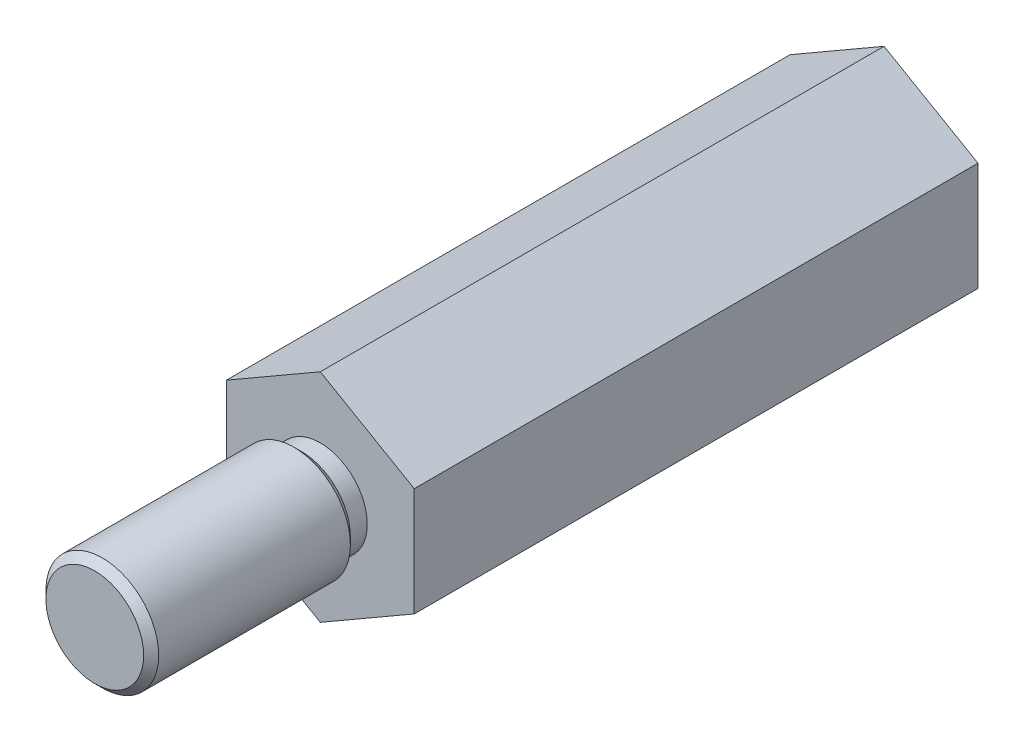
ISO-10303-21;
HEADER;
FILE_DESCRIPTION(('STEP AP214'),'2;1');
FILE_NAME('part.step','',(''),(''),'','','');
FILE_SCHEMA(('AUTOMOTIVE_DESIGN { 1 0 10303 214 1 1 1 1 }'));
ENDSEC;
DATA;
#1=APPLICATION_CONTEXT('core data for automotive mechanical design processes');
#2=APPLICATION_PROTOCOL_DEFINITION('international standard','automotive_design',2000,#1);
#3=PRODUCT_CONTEXT('',#1,'mechanical');
#4=PRODUCT('Part','Part','',(#3));
#5=PRODUCT_RELATED_PRODUCT_CATEGORY('part','',(#4));
#6=PRODUCT_DEFINITION_FORMATION('','',#4);
#7=PRODUCT_DEFINITION_CONTEXT('part definition',#1,'design');
#8=PRODUCT_DEFINITION('design','',#6,#7);
#9=PRODUCT_DEFINITION_SHAPE('','',#8);
#10=(LENGTH_UNIT() NAMED_UNIT(*) SI_UNIT(.MILLI.,.METRE.));
#11=(NAMED_UNIT(*) PLANE_ANGLE_UNIT() SI_UNIT($,.RADIAN.));
#12=(NAMED_UNIT(*) SI_UNIT($,.STERADIAN.) SOLID_ANGLE_UNIT());
#13=UNCERTAINTY_MEASURE_WITH_UNIT(LENGTH_MEASURE(1.E-05),#10,'distance_accuracy_value','');
#14=(GEOMETRIC_REPRESENTATION_CONTEXT(3) GLOBAL_UNCERTAINTY_ASSIGNED_CONTEXT((#13)) GLOBAL_UNIT_ASSIGNED_CONTEXT((#10,
#11,#12)) REPRESENTATION_CONTEXT('',''));
#15=CARTESIAN_POINT('',(0.,0.,0.));
#16=DIRECTION('',(0.,0.,1.));
#17=DIRECTION('',(1.,0.,0.));
#18=AXIS2_PLACEMENT_3D('',#15,#16,#17);
#19=CARTESIAN_POINT('',(0.,2.88675134594813,15.));
#20=DIRECTION('',(0.,0.,1.));
#21=DIRECTION('',(1.,0.,0.));
#22=AXIS2_PLACEMENT_3D('',#19,#20,#21);
#23=PLANE('',#22);
#24=DIRECTION('',(-0.866025403784439,0.5,0.));
#25=VECTOR('',#24,1.);
#26=CARTESIAN_POINT('',(2.5,1.44337567297407,15.));
#27=LINE('',#26,#25);
#28=CARTESIAN_POINT('',(2.5,1.44337567297407,15.));
#29=VERTEX_POINT('',#28);
#30=CARTESIAN_POINT('',(0.,2.88675134594813,15.));
#31=VERTEX_POINT('',#30);
#32=EDGE_CURVE('E130',#29,#31,#27,.T.);
#33=ORIENTED_EDGE('',*,*,#32,.T.);
#34=DIRECTION('',(-0.866025403784438,-0.5,0.));
#35=VECTOR('',#34,1.);
#36=CARTESIAN_POINT('',(0.,2.88675134594813,15.));
#37=LINE('',#36,#35);
#38=CARTESIAN_POINT('',(-2.5,1.44337567297407,15.));
#39=VERTEX_POINT('',#38);
#40=EDGE_CURVE('E87',#31,#39,#37,.T.);
#41=ORIENTED_EDGE('',*,*,#40,.T.);
#42=DIRECTION('',(0.,-1.,0.));
#43=VECTOR('',#42,1.);
#44=CARTESIAN_POINT('',(-2.5,1.44337567297407,15.));
#45=LINE('',#44,#43);
#46=CARTESIAN_POINT('',(-2.5,-1.44337567297406,15.));
#47=VERTEX_POINT('',#46);
#48=EDGE_CURVE('E101',#39,#47,#45,.T.);
#49=ORIENTED_EDGE('',*,*,#48,.T.);
#50=DIRECTION('',(0.866025403784439,-0.5,0.));
#51=VECTOR('',#50,1.);
#52=CARTESIAN_POINT('',(-2.5,-1.44337567297406,15.));
#53=LINE('',#52,#51);
#54=CARTESIAN_POINT('',(0.,-2.88675134594813,15.));
#55=VERTEX_POINT('',#54);
#56=EDGE_CURVE('E95',#47,#55,#53,.T.);
#57=ORIENTED_EDGE('',*,*,#56,.T.);
#58=DIRECTION('',(0.866025403784439,0.5,0.));
#59=VECTOR('',#58,1.);
#60=CARTESIAN_POINT('',(0.,-2.88675134594813,15.));
#61=LINE('',#60,#59);
#62=CARTESIAN_POINT('',(2.5,-1.44337567297407,15.));
#63=VERTEX_POINT('',#62);
#64=EDGE_CURVE('E99',#55,#63,#61,.T.);
#65=ORIENTED_EDGE('',*,*,#64,.T.);
#66=DIRECTION('',(0.,1.,0.));
#67=VECTOR('',#66,1.);
#68=CARTESIAN_POINT('',(2.5,-1.44337567297407,15.));
#69=LINE('',#68,#67);
#70=EDGE_CURVE('E48',#63,#29,#69,.T.);
#71=ORIENTED_EDGE('',*,*,#70,.T.);
#72=EDGE_LOOP('',(#33,#41,#49,#57,#65,#71));
#73=FACE_BOUND('',#72,.T.);
#74=CARTESIAN_POINT('',(0.,0.,15.));
#75=DIRECTION('',(0.,0.,1.));
#76=DIRECTION('',(1.,0.,0.));
#77=AXIS2_PLACEMENT_3D('',#74,#75,#76);
#78=CIRCLE('',#77,1.25);
#79=CARTESIAN_POINT('',(1.25,0.,15.));
#80=VERTEX_POINT('',#79);
#81=EDGE_CURVE('E212',#80,#80,#78,.T.);
#82=ORIENTED_EDGE('',*,*,#81,.F.);
#83=EDGE_LOOP('',(#82));
#84=FACE_BOUND('',#83,.T.);
#85=ADVANCED_FACE('F31',(#73,#84),#23,.T.);
#86=CARTESIAN_POINT('',(2.5,1.44337567297407,15.));
#87=DIRECTION('',(-0.5,-0.866025403784439,0.));
#88=DIRECTION('',(0.866025403784439,-0.5,0.));
#89=AXIS2_PLACEMENT_3D('',#86,#87,#88);
#90=PLANE('',#89);
#91=DIRECTION('',(-0.866025403784439,0.5,0.));
#92=VECTOR('',#91,1.);
#93=CARTESIAN_POINT('',(2.5,1.44337567297407,0.));
#94=LINE('',#93,#92);
#95=CARTESIAN_POINT('',(2.5,1.44337567297407,0.));
#96=VERTEX_POINT('',#95);
#97=CARTESIAN_POINT('',(0.,2.88675134594813,0.));
#98=VERTEX_POINT('',#97);
#99=EDGE_CURVE('E119',#96,#98,#94,.T.);
#100=ORIENTED_EDGE('',*,*,#99,.T.);
#101=DIRECTION('',(0.,0.,-1.));
#102=VECTOR('',#101,1.);
#103=CARTESIAN_POINT('',(0.,2.88675134594813,15.));
#104=LINE('',#103,#102);
#105=EDGE_CURVE('E137',#31,#98,#104,.T.);
#106=ORIENTED_EDGE('',*,*,#105,.F.);
#107=ORIENTED_EDGE('',*,*,#32,.F.);
#108=DIRECTION('',(0.,0.,-1.));
#109=VECTOR('',#108,1.);
#110=CARTESIAN_POINT('',(2.5,1.44337567297407,15.));
#111=LINE('',#110,#109);
#112=EDGE_CURVE('E115',#29,#96,#111,.T.);
#113=ORIENTED_EDGE('',*,*,#112,.T.);
#114=EDGE_LOOP('',(#100,#106,#107,#113));
#115=FACE_BOUND('',#114,.T.);
#116=ADVANCED_FACE('F177',(#115),#90,.F.);
#117=CARTESIAN_POINT('',(0.,2.88675134594813,15.));
#118=DIRECTION('',(0.5,-0.866025403784438,0.));
#119=DIRECTION('',(0.866025403784439,0.5,0.));
#120=AXIS2_PLACEMENT_3D('',#117,#118,#119);
#121=PLANE('',#120);
#122=DIRECTION('',(-0.866025403784438,-0.5,0.));
#123=VECTOR('',#122,1.);
#124=CARTESIAN_POINT('',(0.,2.88675134594813,0.));
#125=LINE('',#124,#123);
#126=CARTESIAN_POINT('',(-2.5,1.44337567297407,0.));
#127=VERTEX_POINT('',#126);
#128=EDGE_CURVE('E122',#98,#127,#125,.T.);
#129=ORIENTED_EDGE('',*,*,#128,.T.);
#130=DIRECTION('',(0.,0.,-1.));
#131=VECTOR('',#130,1.);
#132=CARTESIAN_POINT('',(-2.5,1.44337567297407,15.));
#133=LINE('',#132,#131);
#134=EDGE_CURVE('E134',#39,#127,#133,.T.);
#135=ORIENTED_EDGE('',*,*,#134,.F.);
#136=ORIENTED_EDGE('',*,*,#40,.F.);
#137=ORIENTED_EDGE('',*,*,#105,.T.);
#138=EDGE_LOOP('',(#129,#135,#136,#137));
#139=FACE_BOUND('',#138,.T.);
#140=ADVANCED_FACE('F182',(#139),#121,.F.);
#141=CARTESIAN_POINT('',(-2.5,1.44337567297407,15.));
#142=DIRECTION('',(1.,0.,0.));
#143=DIRECTION('',(0.,0.,-1.));
#144=AXIS2_PLACEMENT_3D('',#141,#142,#143);
#145=PLANE('',#144);
#146=DIRECTION('',(0.,-1.,0.));
#147=VECTOR('',#146,1.);
#148=CARTESIAN_POINT('',(-2.5,1.44337567297407,0.));
#149=LINE('',#148,#147);
#150=CARTESIAN_POINT('',(-2.5,-1.44337567297406,0.));
#151=VERTEX_POINT('',#150);
#152=EDGE_CURVE('E125',#127,#151,#149,.T.);
#153=ORIENTED_EDGE('',*,*,#152,.T.);
#154=DIRECTION('',(0.,0.,-1.));
#155=VECTOR('',#154,1.);
#156=CARTESIAN_POINT('',(-2.5,-1.44337567297406,15.));
#157=LINE('',#156,#155);
#158=EDGE_CURVE('E110',#47,#151,#157,.T.);
#159=ORIENTED_EDGE('',*,*,#158,.F.);
#160=ORIENTED_EDGE('',*,*,#48,.F.);
#161=ORIENTED_EDGE('',*,*,#134,.T.);
#162=EDGE_LOOP('',(#153,#159,#160,#161));
#163=FACE_BOUND('',#162,.T.);
#164=ADVANCED_FACE('F197',(#163),#145,.F.);
#165=CARTESIAN_POINT('',(-2.5,-1.44337567297406,15.));
#166=DIRECTION('',(0.5,0.866025403784439,0.));
#167=DIRECTION('',(-0.866025403784439,0.5,0.));
#168=AXIS2_PLACEMENT_3D('',#165,#166,#167);
#169=PLANE('',#168);
#170=DIRECTION('',(0.866025403784439,-0.5,0.));
#171=VECTOR('',#170,1.);
#172=CARTESIAN_POINT('',(-2.5,-1.44337567297406,0.));
#173=LINE('',#172,#171);
#174=CARTESIAN_POINT('',(0.,-2.88675134594813,0.));
#175=VERTEX_POINT('',#174);
#176=EDGE_CURVE('E109',#151,#175,#173,.T.);
#177=ORIENTED_EDGE('',*,*,#176,.T.);
#178=DIRECTION('',(0.,0.,-1.));
#179=VECTOR('',#178,1.);
#180=CARTESIAN_POINT('',(0.,-2.88675134594813,15.));
#181=LINE('',#180,#179);
#182=EDGE_CURVE('E106',#55,#175,#181,.T.);
#183=ORIENTED_EDGE('',*,*,#182,.F.);
#184=ORIENTED_EDGE('',*,*,#56,.F.);
#185=ORIENTED_EDGE('',*,*,#158,.T.);
#186=EDGE_LOOP('',(#177,#183,#184,#185));
#187=FACE_BOUND('',#186,.T.);
#188=ADVANCED_FACE('F107',(#187),#169,.F.);
#189=CARTESIAN_POINT('',(0.,-2.88675134594813,15.));
#190=DIRECTION('',(-0.5,0.866025403784439,0.));
#191=DIRECTION('',(-0.866025403784439,-0.5,0.));
#192=AXIS2_PLACEMENT_3D('',#189,#190,#191);
#193=PLANE('',#192);
#194=DIRECTION('',(0.866025403784439,0.5,0.));
#195=VECTOR('',#194,1.);
#196=CARTESIAN_POINT('',(0.,-2.88675134594813,0.));
#197=LINE('',#196,#195);
#198=CARTESIAN_POINT('',(2.5,-1.44337567297407,0.));
#199=VERTEX_POINT('',#198);
#200=EDGE_CURVE('E72',#175,#199,#197,.T.);
#201=ORIENTED_EDGE('',*,*,#200,.T.);
#202=DIRECTION('',(0.,0.,-1.));
#203=VECTOR('',#202,1.);
#204=CARTESIAN_POINT('',(2.5,-1.44337567297407,15.));
#205=LINE('',#204,#203);
#206=EDGE_CURVE('E111',#63,#199,#205,.T.);
#207=ORIENTED_EDGE('',*,*,#206,.F.);
#208=ORIENTED_EDGE('',*,*,#64,.F.);
#209=ORIENTED_EDGE('',*,*,#182,.T.);
#210=EDGE_LOOP('',(#201,#207,#208,#209));
#211=FACE_BOUND('',#210,.T.);
#212=ADVANCED_FACE('F113',(#211),#193,.F.);
#213=CARTESIAN_POINT('',(2.5,-1.44337567297407,15.));
#214=DIRECTION('',(-1.,0.,0.));
#215=DIRECTION('',(0.,0.,1.));
#216=AXIS2_PLACEMENT_3D('',#213,#214,#215);
#217=PLANE('',#216);
#218=DIRECTION('',(0.,1.,0.));
#219=VECTOR('',#218,1.);
#220=CARTESIAN_POINT('',(2.5,-1.44337567297407,0.));
#221=LINE('',#220,#219);
#222=EDGE_CURVE('E78',#199,#96,#221,.T.);
#223=ORIENTED_EDGE('',*,*,#222,.T.);
#224=ORIENTED_EDGE('',*,*,#112,.F.);
#225=ORIENTED_EDGE('',*,*,#70,.F.);
#226=ORIENTED_EDGE('',*,*,#206,.T.);
#227=EDGE_LOOP('',(#223,#224,#225,#226));
#228=FACE_BOUND('',#227,.T.);
#229=ADVANCED_FACE('F189',(#228),#217,.F.);
#230=CARTESIAN_POINT('',(0.,2.88675134594813,0.));
#231=DIRECTION('',(0.,0.,1.));
#232=DIRECTION('',(1.,0.,0.));
#233=AXIS2_PLACEMENT_3D('',#230,#231,#232);
#234=PLANE('',#233);
#235=CARTESIAN_POINT('',(0.,0.,0.));
#236=DIRECTION('',(0.,0.,-1.));
#237=DIRECTION('',(-1.,0.,0.));
#238=AXIS2_PLACEMENT_3D('',#235,#236,#237);
#239=CIRCLE('',#238,1.5);
#240=CARTESIAN_POINT('',(-1.5,0.,0.));
#241=VERTEX_POINT('',#240);
#242=EDGE_CURVE('E215',#241,#241,#239,.T.);
#243=ORIENTED_EDGE('',*,*,#242,.F.);
#244=EDGE_LOOP('',(#243));
#245=FACE_BOUND('',#244,.T.);
#246=ORIENTED_EDGE('',*,*,#99,.F.);
#247=ORIENTED_EDGE('',*,*,#222,.F.);
#248=ORIENTED_EDGE('',*,*,#200,.F.);
#249=ORIENTED_EDGE('',*,*,#176,.F.);
#250=ORIENTED_EDGE('',*,*,#152,.F.);
#251=ORIENTED_EDGE('',*,*,#128,.F.);
#252=EDGE_LOOP('',(#246,#247,#248,#249,#250,#251));
#253=FACE_BOUND('',#252,.T.);
#254=ADVANCED_FACE('F186',(#245,#253),#234,.F.);
#255=CARTESIAN_POINT('',(0.,0.,15.5));
#256=DIRECTION('',(0.,0.,1.));
#257=DIRECTION('',(1.,0.,0.));
#258=AXIS2_PLACEMENT_3D('',#255,#256,#257);
#259=PLANE('',#258);
#260=CARTESIAN_POINT('',(0.,0.,15.5));
#261=DIRECTION('',(0.,0.,1.));
#262=DIRECTION('',(1.,0.,0.));
#263=AXIS2_PLACEMENT_3D('',#260,#261,#262);
#264=CIRCLE('',#263,1.3);
#265=CARTESIAN_POINT('',(1.3,0.,15.5));
#266=VERTEX_POINT('',#265);
#267=EDGE_CURVE('E40',#266,#266,#264,.F.);
#268=ORIENTED_EDGE('',*,*,#267,.T.);
#269=EDGE_LOOP('',(#268));
#270=FACE_BOUND('',#269,.T.);
#271=CARTESIAN_POINT('',(0.,0.,15.5));
#272=DIRECTION('',(0.,0.,1.));
#273=DIRECTION('',(1.,0.,0.));
#274=AXIS2_PLACEMENT_3D('',#271,#272,#273);
#275=CIRCLE('',#274,1.25);
#276=CARTESIAN_POINT('',(1.25,0.,15.5));
#277=VERTEX_POINT('',#276);
#278=EDGE_CURVE('E123',#277,#277,#275,.T.);
#279=ORIENTED_EDGE('',*,*,#278,.T.);
#280=EDGE_LOOP('',(#279));
#281=FACE_BOUND('',#280,.T.);
#282=ADVANCED_FACE('F147',(#270,#281),#259,.F.);
#283=CARTESIAN_POINT('',(0.,0.,15.5));
#284=DIRECTION('',(0.,0.,-1.));
#285=DIRECTION('',(-1.,0.,0.));
#286=AXIS2_PLACEMENT_3D('',#283,#284,#285);
#287=CYLINDRICAL_SURFACE('',#286,1.25);
#288=ORIENTED_EDGE('',*,*,#278,.F.);
#289=EDGE_LOOP('',(#288));
#290=FACE_BOUND('',#289,.T.);
#291=ORIENTED_EDGE('',*,*,#81,.T.);
#292=EDGE_LOOP('',(#291));
#293=FACE_BOUND('',#292,.T.);
#294=ADVANCED_FACE('F168',(#290,#293),#287,.T.);
#295=CARTESIAN_POINT('',(0.,0.,21.));
#296=DIRECTION('',(0.,0.,1.));
#297=DIRECTION('',(1.,0.,0.));
#298=AXIS2_PLACEMENT_3D('',#295,#296,#297);
#299=PLANE('',#298);
#300=CARTESIAN_POINT('',(0.,0.,21.));
#301=DIRECTION('',(0.,0.,1.));
#302=DIRECTION('',(1.,0.,0.));
#303=AXIS2_PLACEMENT_3D('',#300,#301,#302);
#304=CIRCLE('',#303,1.3);
#305=CARTESIAN_POINT('',(1.3,0.,21.));
#306=VERTEX_POINT('',#305);
#307=EDGE_CURVE('E11',#306,#306,#304,.T.);
#308=ORIENTED_EDGE('',*,*,#307,.T.);
#309=EDGE_LOOP('',(#308));
#310=FACE_BOUND('',#309,.T.);
#311=ADVANCED_FACE('F158',(#310),#299,.T.);
#312=CARTESIAN_POINT('',(0.,0.,21.));
#313=DIRECTION('',(0.,0.,-1.));
#314=DIRECTION('',(-1.,0.,0.));
#315=AXIS2_PLACEMENT_3D('',#312,#313,#314);
#316=CYLINDRICAL_SURFACE('',#315,1.5);
#317=CARTESIAN_POINT('',(0.,0.,15.7));
#318=DIRECTION('',(0.,0.,1.));
#319=DIRECTION('',(1.,0.,0.));
#320=AXIS2_PLACEMENT_3D('',#317,#318,#319);
#321=CIRCLE('',#320,1.5);
#322=CARTESIAN_POINT('',(1.5,0.,15.7));
#323=VERTEX_POINT('',#322);
#324=EDGE_CURVE('E142',#323,#323,#321,.T.);
#325=ORIENTED_EDGE('',*,*,#324,.T.);
#326=EDGE_LOOP('',(#325));
#327=FACE_BOUND('',#326,.T.);
#328=CARTESIAN_POINT('',(0.,0.,20.8));
#329=DIRECTION('',(0.,0.,1.));
#330=DIRECTION('',(1.,0.,0.));
#331=AXIS2_PLACEMENT_3D('',#328,#329,#330);
#332=CIRCLE('',#331,1.5);
#333=CARTESIAN_POINT('',(1.5,0.,20.8));
#334=VERTEX_POINT('',#333);
#335=EDGE_CURVE('E139',#334,#334,#332,.F.);
#336=ORIENTED_EDGE('',*,*,#335,.T.);
#337=EDGE_LOOP('',(#336));
#338=FACE_BOUND('',#337,.T.);
#339=ADVANCED_FACE('F153',(#327,#338),#316,.T.);
#340=CARTESIAN_POINT('',(0.,0.,15.7));
#341=DIRECTION('',(0.,0.,1.));
#342=DIRECTION('',(1.,0.,0.));
#343=AXIS2_PLACEMENT_3D('',#340,#341,#342);
#344=CONICAL_SURFACE('',#343,1.5,0.785398163397443);
#345=ORIENTED_EDGE('',*,*,#267,.F.);
#346=EDGE_LOOP('',(#345));
#347=FACE_BOUND('',#346,.T.);
#348=ORIENTED_EDGE('',*,*,#324,.F.);
#349=EDGE_LOOP('',(#348));
#350=FACE_BOUND('',#349,.T.);
#351=ADVANCED_FACE('F150',(#347,#350),#344,.T.);
#352=CARTESIAN_POINT('',(0.,0.,21.));
#353=DIRECTION('',(0.,0.,-1.));
#354=DIRECTION('',(-1.,0.,0.));
#355=AXIS2_PLACEMENT_3D('',#352,#353,#354);
#356=CONICAL_SURFACE('',#355,1.3,0.785398163397447);
#357=ORIENTED_EDGE('',*,*,#335,.F.);
#358=EDGE_LOOP('',(#357));
#359=FACE_BOUND('',#358,.T.);
#360=ORIENTED_EDGE('',*,*,#307,.F.);
#361=EDGE_LOOP('',(#360));
#362=FACE_BOUND('',#361,.T.);
#363=ADVANCED_FACE('F33',(#359,#362),#356,.T.);
#364=CARTESIAN_POINT('',(0.,0.,0.));
#365=DIRECTION('',(0.,0.,-1.));
#366=DIRECTION('',(-1.,0.,0.));
#367=AXIS2_PLACEMENT_3D('',#364,#365,#366);
#368=CONICAL_SURFACE('',#367,1.5,0.785398163397451);
#369=CARTESIAN_POINT('',(0.,0.,0.249999999999999));
#370=DIRECTION('',(0.,0.,-1.));
#371=DIRECTION('',(-1.,0.,0.));
#372=AXIS2_PLACEMENT_3D('',#369,#370,#371);
#373=CIRCLE('',#372,1.25);
#374=CARTESIAN_POINT('',(-1.25,0.,0.249999999999999));
#375=VERTEX_POINT('',#374);
#376=EDGE_CURVE('E220',#375,#375,#373,.T.);
#377=ORIENTED_EDGE('',*,*,#376,.F.);
#378=EDGE_LOOP('',(#377));
#379=FACE_BOUND('',#378,.T.);
#380=ORIENTED_EDGE('',*,*,#242,.T.);
#381=EDGE_LOOP('',(#380));
#382=FACE_BOUND('',#381,.T.);
#383=ADVANCED_FACE('F164',(#379,#382),#368,.F.);
#384=CARTESIAN_POINT('',(0.,0.,0.));
#385=DIRECTION('',(0.,0.,-1.));
#386=DIRECTION('',(-1.,0.,0.));
#387=AXIS2_PLACEMENT_3D('',#384,#385,#386);
#388=CYLINDRICAL_SURFACE('',#387,1.25);
#389=CARTESIAN_POINT('',(0.,0.,6.));
#390=DIRECTION('',(0.,0.,-1.));
#391=DIRECTION('',(-1.,0.,0.));
#392=AXIS2_PLACEMENT_3D('',#389,#390,#391);
#393=CIRCLE('',#392,1.25);
#394=CARTESIAN_POINT('',(-1.25,0.,6.));
#395=VERTEX_POINT('',#394);
#396=EDGE_CURVE('E223',#395,#395,#393,.T.);
#397=ORIENTED_EDGE('',*,*,#396,.F.);
#398=EDGE_LOOP('',(#397));
#399=FACE_BOUND('',#398,.T.);
#400=ORIENTED_EDGE('',*,*,#376,.T.);
#401=EDGE_LOOP('',(#400));
#402=FACE_BOUND('',#401,.T.);
#403=ADVANCED_FACE('F229',(#399,#402),#388,.F.);
#404=CARTESIAN_POINT('',(0.,0.,6.));
#405=DIRECTION('',(0.,0.,-1.));
#406=DIRECTION('',(-1.,0.,0.));
#407=AXIS2_PLACEMENT_3D('',#404,#405,#406);
#408=CONICAL_SURFACE('',#407,1.25,1.02974425867665);
#409=CARTESIAN_POINT('',(0.,0.,6.75107577378445));
#410=VERTEX_POINT('',#409);
#411=VERTEX_LOOP('',#410);
#412=FACE_BOUND('',#411,.T.);
#413=ORIENTED_EDGE('',*,*,#396,.T.);
#414=EDGE_LOOP('',(#413));
#415=FACE_BOUND('',#414,.T.);
#416=ADVANCED_FACE('F227',(#412,#415),#408,.F.);
#417=CLOSED_SHELL('',(#85,#116,#140,#164,#188,#212,#229,#254,#282,#294,#311,#339,#351,#363,#383,
#403,#416));
#418=MANIFOLD_SOLID_BREP('B2',#417);
#419=ADVANCED_BREP_SHAPE_REPRESENTATION('',(#18,#418),#14);
#420=SHAPE_DEFINITION_REPRESENTATION(#9,#419);
ENDSEC;
END-ISO-10303-21;
